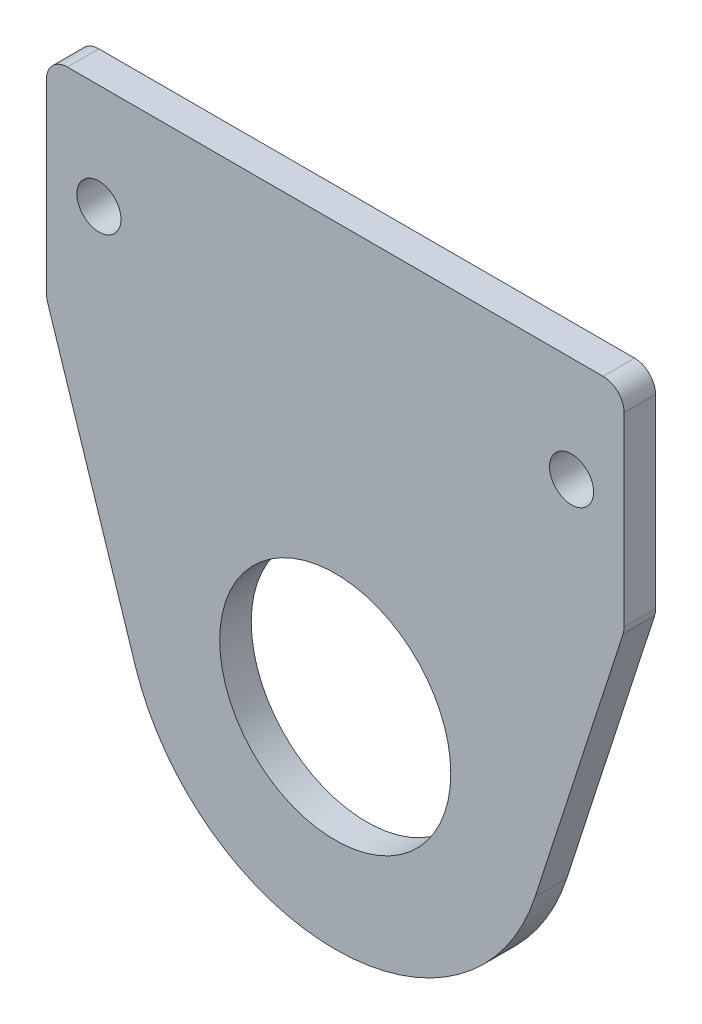
ISO-10303-21;
HEADER;
FILE_DESCRIPTION(('STEP AP214'),'2;1');
FILE_NAME('part.step','',(''),(''),'','','');
FILE_SCHEMA(('AUTOMOTIVE_DESIGN { 1 0 10303 214 1 1 1 1 }'));
ENDSEC;
DATA;
#1=APPLICATION_CONTEXT('core data for automotive mechanical design processes');
#2=APPLICATION_PROTOCOL_DEFINITION('international standard','automotive_design',2000,#1);
#3=PRODUCT_CONTEXT('',#1,'mechanical');
#4=PRODUCT('Part','Part','',(#3));
#5=PRODUCT_RELATED_PRODUCT_CATEGORY('part','',(#4));
#6=PRODUCT_DEFINITION_FORMATION('','',#4);
#7=PRODUCT_DEFINITION_CONTEXT('part definition',#1,'design');
#8=PRODUCT_DEFINITION('design','',#6,#7);
#9=PRODUCT_DEFINITION_SHAPE('','',#8);
#10=(LENGTH_UNIT() NAMED_UNIT(*) SI_UNIT(.MILLI.,.METRE.));
#11=(NAMED_UNIT(*) PLANE_ANGLE_UNIT() SI_UNIT($,.RADIAN.));
#12=(NAMED_UNIT(*) SI_UNIT($,.STERADIAN.) SOLID_ANGLE_UNIT());
#13=UNCERTAINTY_MEASURE_WITH_UNIT(LENGTH_MEASURE(1.E-05),#10,'distance_accuracy_value','');
#14=(GEOMETRIC_REPRESENTATION_CONTEXT(3) GLOBAL_UNCERTAINTY_ASSIGNED_CONTEXT((#13)) GLOBAL_UNIT_ASSIGNED_CONTEXT((#10,
#11,#12)) REPRESENTATION_CONTEXT('',''));
#15=CARTESIAN_POINT('',(0.,0.,0.));
#16=DIRECTION('',(0.,0.,1.));
#17=DIRECTION('',(1.,0.,0.));
#18=AXIS2_PLACEMENT_3D('',#15,#16,#17);
#19=CARTESIAN_POINT('',(27.5,0.,3.));
#20=DIRECTION('',(1.,0.,0.));
#21=DIRECTION('',(0.,0.,-1.));
#22=AXIS2_PLACEMENT_3D('',#19,#20,#21);
#23=PLANE('',#22);
#24=DIRECTION('',(0.,-1.,0.));
#25=VECTOR('',#24,1.);
#26=CARTESIAN_POINT('',(27.5,0.,3.));
#27=LINE('',#26,#25);
#28=CARTESIAN_POINT('',(27.5,8.,3.));
#29=VERTEX_POINT('',#28);
#30=CARTESIAN_POINT('',(27.5,-9.68421052631579,3.));
#31=VERTEX_POINT('',#30);
#32=EDGE_CURVE('E181',#29,#31,#27,.T.);
#33=ORIENTED_EDGE('',*,*,#32,.T.);
#34=DIRECTION('',(0.,0.,-1.));
#35=VECTOR('',#34,1.);
#36=CARTESIAN_POINT('',(27.5,-9.68421052631579,3.));
#37=LINE('',#36,#35);
#38=CARTESIAN_POINT('',(27.5,-9.68421052631579,0.));
#39=VERTEX_POINT('',#38);
#40=EDGE_CURVE('E205',#31,#39,#37,.T.);
#41=ORIENTED_EDGE('',*,*,#40,.T.);
#42=DIRECTION('',(0.,-1.,0.));
#43=VECTOR('',#42,1.);
#44=CARTESIAN_POINT('',(27.5,0.,0.));
#45=LINE('',#44,#43);
#46=CARTESIAN_POINT('',(27.5,8.,0.));
#47=VERTEX_POINT('',#46);
#48=EDGE_CURVE('E158',#47,#39,#45,.T.);
#49=ORIENTED_EDGE('',*,*,#48,.F.);
#50=DIRECTION('',(0.,0.,-1.));
#51=VECTOR('',#50,1.);
#52=CARTESIAN_POINT('',(27.5,8.,3.));
#53=LINE('',#52,#51);
#54=EDGE_CURVE('E203',#47,#29,#53,.F.);
#55=ORIENTED_EDGE('',*,*,#54,.T.);
#56=EDGE_LOOP('',(#33,#41,#49,#55));
#57=FACE_BOUND('',#56,.T.);
#58=ADVANCED_FACE('F37',(#57),#23,.T.);
#59=CARTESIAN_POINT('',(0.,10.,3.));
#60=DIRECTION('',(0.,1.,0.));
#61=DIRECTION('',(0.,0.,1.));
#62=AXIS2_PLACEMENT_3D('',#59,#60,#61);
#63=PLANE('',#62);
#64=DIRECTION('',(1.,0.,0.));
#65=VECTOR('',#64,1.);
#66=CARTESIAN_POINT('',(0.,10.,3.));
#67=LINE('',#66,#65);
#68=CARTESIAN_POINT('',(-25.5,10.,3.));
#69=VERTEX_POINT('',#68);
#70=CARTESIAN_POINT('',(25.5,10.,3.));
#71=VERTEX_POINT('',#70);
#72=EDGE_CURVE('E212',#69,#71,#67,.T.);
#73=ORIENTED_EDGE('',*,*,#72,.T.);
#74=DIRECTION('',(0.,0.,-1.));
#75=VECTOR('',#74,1.);
#76=CARTESIAN_POINT('',(25.5,10.,3.));
#77=LINE('',#76,#75);
#78=CARTESIAN_POINT('',(25.5,10.,0.));
#79=VERTEX_POINT('',#78);
#80=EDGE_CURVE('E11',#71,#79,#77,.T.);
#81=ORIENTED_EDGE('',*,*,#80,.T.);
#82=DIRECTION('',(1.,0.,0.));
#83=VECTOR('',#82,1.);
#84=CARTESIAN_POINT('',(0.,10.,0.));
#85=LINE('',#84,#83);
#86=CARTESIAN_POINT('',(-25.5,10.,0.));
#87=VERTEX_POINT('',#86);
#88=EDGE_CURVE('E161',#87,#79,#85,.T.);
#89=ORIENTED_EDGE('',*,*,#88,.F.);
#90=DIRECTION('',(0.,0.,-1.));
#91=VECTOR('',#90,1.);
#92=CARTESIAN_POINT('',(-25.5,10.,3.));
#93=LINE('',#92,#91);
#94=EDGE_CURVE('E45',#87,#69,#93,.F.);
#95=ORIENTED_EDGE('',*,*,#94,.T.);
#96=EDGE_LOOP('',(#73,#81,#89,#95));
#97=FACE_BOUND('',#96,.T.);
#98=ADVANCED_FACE('F211',(#97),#63,.T.);
#99=CARTESIAN_POINT('',(-27.5,0.,3.));
#100=DIRECTION('',(1.,0.,0.));
#101=DIRECTION('',(0.,0.,-1.));
#102=AXIS2_PLACEMENT_3D('',#99,#100,#101);
#103=PLANE('',#102);
#104=DIRECTION('',(0.,-1.,0.));
#105=VECTOR('',#104,1.);
#106=CARTESIAN_POINT('',(-27.5,0.,0.));
#107=LINE('',#106,#105);
#108=CARTESIAN_POINT('',(-27.5,8.,0.));
#109=VERTEX_POINT('',#108);
#110=CARTESIAN_POINT('',(-27.5,-9.68421052631581,0.));
#111=VERTEX_POINT('',#110);
#112=EDGE_CURVE('E164',#109,#111,#107,.T.);
#113=ORIENTED_EDGE('',*,*,#112,.T.);
#114=DIRECTION('',(0.,0.,-1.));
#115=VECTOR('',#114,1.);
#116=CARTESIAN_POINT('',(-27.5,-9.68421052631581,3.));
#117=LINE('',#116,#115);
#118=CARTESIAN_POINT('',(-27.5,-9.68421052631581,3.));
#119=VERTEX_POINT('',#118);
#120=EDGE_CURVE('E195',#111,#119,#117,.F.);
#121=ORIENTED_EDGE('',*,*,#120,.T.);
#122=DIRECTION('',(0.,-1.,0.));
#123=VECTOR('',#122,1.);
#124=CARTESIAN_POINT('',(-27.5,0.,3.));
#125=LINE('',#124,#123);
#126=CARTESIAN_POINT('',(-27.5,8.,3.));
#127=VERTEX_POINT('',#126);
#128=EDGE_CURVE('E129',#127,#119,#125,.T.);
#129=ORIENTED_EDGE('',*,*,#128,.F.);
#130=DIRECTION('',(0.,0.,-1.));
#131=VECTOR('',#130,1.);
#132=CARTESIAN_POINT('',(-27.5,8.,0.));
#133=LINE('',#132,#131);
#134=EDGE_CURVE('E192',#127,#109,#133,.T.);
#135=ORIENTED_EDGE('',*,*,#134,.T.);
#136=EDGE_LOOP('',(#113,#121,#129,#135));
#137=FACE_BOUND('',#136,.T.);
#138=ADVANCED_FACE('F221',(#137),#103,.F.);
#139=CARTESIAN_POINT('',(-27.8205989773557,-9.01008035062088,3.));
#140=DIRECTION('',(0.951351351351351,0.308108108108108,0.));
#141=DIRECTION('',(-0.308108108108108,0.951351351351352,0.));
#142=AXIS2_PLACEMENT_3D('',#139,#140,#141);
#143=PLANE('',#142);
#144=DIRECTION('',(0.308108108108108,-0.951351351351352,0.));
#145=VECTOR('',#144,1.);
#146=CARTESIAN_POINT('',(-27.8205989773557,-9.01008035062088,3.));
#147=LINE('',#146,#145);
#148=CARTESIAN_POINT('',(-27.4027027027027,-10.300426742532,3.));
#149=VERTEX_POINT('',#148);
#150=CARTESIAN_POINT('',(-19.027027027027,-36.1621621621621,3.));
#151=VERTEX_POINT('',#150);
#152=EDGE_CURVE('E116',#149,#151,#147,.T.);
#153=ORIENTED_EDGE('',*,*,#152,.F.);
#154=DIRECTION('',(0.,0.,-1.));
#155=VECTOR('',#154,1.);
#156=CARTESIAN_POINT('',(-27.4027027027027,-10.300426742532,3.));
#157=LINE('',#156,#155);
#158=CARTESIAN_POINT('',(-27.4027027027027,-10.300426742532,0.));
#159=VERTEX_POINT('',#158);
#160=EDGE_CURVE('E139',#149,#159,#157,.T.);
#161=ORIENTED_EDGE('',*,*,#160,.T.);
#162=DIRECTION('',(0.308108108108108,-0.951351351351352,0.));
#163=VECTOR('',#162,1.);
#164=CARTESIAN_POINT('',(-27.8205989773557,-9.01008035062088,0.));
#165=LINE('',#164,#163);
#166=CARTESIAN_POINT('',(-19.027027027027,-36.1621621621621,0.));
#167=VERTEX_POINT('',#166);
#168=EDGE_CURVE('E135',#159,#167,#165,.T.);
#169=ORIENTED_EDGE('',*,*,#168,.T.);
#170=DIRECTION('',(0.,0.,-1.));
#171=VECTOR('',#170,1.);
#172=CARTESIAN_POINT('',(-19.027027027027,-36.1621621621621,3.));
#173=LINE('',#172,#171);
#174=EDGE_CURVE('E132',#151,#167,#173,.T.);
#175=ORIENTED_EDGE('',*,*,#174,.F.);
#176=EDGE_LOOP('',(#153,#161,#169,#175));
#177=FACE_BOUND('',#176,.T.);
#178=ADVANCED_FACE('F133',(#177),#143,.F.);
#179=CARTESIAN_POINT('',(0.,-30.,3.));
#180=DIRECTION('',(0.,0.,-1.));
#181=DIRECTION('',(-1.,0.,0.));
#182=AXIS2_PLACEMENT_3D('',#179,#180,#181);
#183=CYLINDRICAL_SURFACE('',#182,20.);
#184=CARTESIAN_POINT('',(0.,-30.,0.));
#185=DIRECTION('',(0.,0.,1.));
#186=DIRECTION('',(1.,0.,0.));
#187=AXIS2_PLACEMENT_3D('',#184,#185,#186);
#188=CIRCLE('',#187,20.);
#189=CARTESIAN_POINT('',(19.027027027027,-36.1621621621621,0.));
#190=VERTEX_POINT('',#189);
#191=EDGE_CURVE('E168',#167,#190,#188,.T.);
#192=ORIENTED_EDGE('',*,*,#191,.T.);
#193=DIRECTION('',(0.,0.,-1.));
#194=VECTOR('',#193,1.);
#195=CARTESIAN_POINT('',(19.027027027027,-36.1621621621621,3.));
#196=LINE('',#195,#194);
#197=CARTESIAN_POINT('',(19.027027027027,-36.1621621621621,3.));
#198=VERTEX_POINT('',#197);
#199=EDGE_CURVE('E140',#198,#190,#196,.T.);
#200=ORIENTED_EDGE('',*,*,#199,.F.);
#201=CARTESIAN_POINT('',(0.,-30.,3.));
#202=DIRECTION('',(0.,0.,1.));
#203=DIRECTION('',(1.,0.,0.));
#204=AXIS2_PLACEMENT_3D('',#201,#202,#203);
#205=CIRCLE('',#204,20.);
#206=EDGE_CURVE('E122',#151,#198,#205,.T.);
#207=ORIENTED_EDGE('',*,*,#206,.F.);
#208=ORIENTED_EDGE('',*,*,#174,.T.);
#209=EDGE_LOOP('',(#192,#200,#207,#208));
#210=FACE_BOUND('',#209,.T.);
#211=ADVANCED_FACE('F142',(#210),#183,.T.);
#212=CARTESIAN_POINT('',(-22.5,0.,3.));
#213=DIRECTION('',(0.,0.,-1.));
#214=DIRECTION('',(-1.,0.,0.));
#215=AXIS2_PLACEMENT_3D('',#212,#213,#214);
#216=CYLINDRICAL_SURFACE('',#215,2.1);
#217=CARTESIAN_POINT('',(-22.5,0.,3.));
#218=DIRECTION('',(0.,0.,1.));
#219=DIRECTION('',(1.,0.,0.));
#220=AXIS2_PLACEMENT_3D('',#217,#218,#219);
#221=CIRCLE('',#220,2.1);
#222=CARTESIAN_POINT('',(-20.4,0.,3.));
#223=VERTEX_POINT('',#222);
#224=EDGE_CURVE('E152',#223,#223,#221,.F.);
#225=ORIENTED_EDGE('',*,*,#224,.F.);
#226=EDGE_LOOP('',(#225));
#227=FACE_BOUND('',#226,.T.);
#228=CARTESIAN_POINT('',(-22.5,0.,0.));
#229=DIRECTION('',(0.,0.,1.));
#230=DIRECTION('',(1.,0.,0.));
#231=AXIS2_PLACEMENT_3D('',#228,#229,#230);
#232=CIRCLE('',#231,2.1);
#233=CARTESIAN_POINT('',(-20.4,0.,0.));
#234=VERTEX_POINT('',#233);
#235=EDGE_CURVE('E175',#234,#234,#232,.F.);
#236=ORIENTED_EDGE('',*,*,#235,.T.);
#237=EDGE_LOOP('',(#236));
#238=FACE_BOUND('',#237,.T.);
#239=ADVANCED_FACE('F248',(#227,#238),#216,.F.);
#240=CARTESIAN_POINT('',(22.5,0.,3.));
#241=DIRECTION('',(0.,0.,-1.));
#242=DIRECTION('',(-1.,0.,0.));
#243=AXIS2_PLACEMENT_3D('',#240,#241,#242);
#244=CYLINDRICAL_SURFACE('',#243,2.1);
#245=CARTESIAN_POINT('',(22.5,0.,3.));
#246=DIRECTION('',(0.,0.,1.));
#247=DIRECTION('',(1.,0.,0.));
#248=AXIS2_PLACEMENT_3D('',#245,#246,#247);
#249=CIRCLE('',#248,2.1);
#250=CARTESIAN_POINT('',(24.6,0.,3.));
#251=VERTEX_POINT('',#250);
#252=EDGE_CURVE('E146',#251,#251,#249,.T.);
#253=ORIENTED_EDGE('',*,*,#252,.T.);
#254=EDGE_LOOP('',(#253));
#255=FACE_BOUND('',#254,.T.);
#256=CARTESIAN_POINT('',(22.5,0.,0.));
#257=DIRECTION('',(0.,0.,1.));
#258=DIRECTION('',(1.,0.,0.));
#259=AXIS2_PLACEMENT_3D('',#256,#257,#258);
#260=CIRCLE('',#259,2.1);
#261=CARTESIAN_POINT('',(24.6,0.,0.));
#262=VERTEX_POINT('',#261);
#263=EDGE_CURVE('E172',#262,#262,#260,.T.);
#264=ORIENTED_EDGE('',*,*,#263,.F.);
#265=EDGE_LOOP('',(#264));
#266=FACE_BOUND('',#265,.T.);
#267=ADVANCED_FACE('F240',(#255,#266),#244,.F.);
#268=CARTESIAN_POINT('',(27.8205989773557,-9.01008035062089,3.));
#269=DIRECTION('',(0.951351351351351,-0.308108108108108,0.));
#270=DIRECTION('',(0.308108108108108,0.951351351351352,0.));
#271=AXIS2_PLACEMENT_3D('',#268,#269,#270);
#272=PLANE('',#271);
#273=DIRECTION('',(-0.308108108108108,-0.951351351351351,0.));
#274=VECTOR('',#273,1.);
#275=CARTESIAN_POINT('',(27.8205989773557,-9.01008035062089,0.));
#276=LINE('',#275,#274);
#277=CARTESIAN_POINT('',(27.4027027027027,-10.300426742532,0.));
#278=VERTEX_POINT('',#277);
#279=EDGE_CURVE('E170',#278,#190,#276,.T.);
#280=ORIENTED_EDGE('',*,*,#279,.F.);
#281=DIRECTION('',(0.,0.,-1.));
#282=VECTOR('',#281,1.);
#283=CARTESIAN_POINT('',(27.4027027027027,-10.300426742532,3.));
#284=LINE('',#283,#282);
#285=CARTESIAN_POINT('',(27.4027027027027,-10.300426742532,3.));
#286=VERTEX_POINT('',#285);
#287=EDGE_CURVE('E52',#278,#286,#284,.F.);
#288=ORIENTED_EDGE('',*,*,#287,.T.);
#289=DIRECTION('',(-0.308108108108108,-0.951351351351351,0.));
#290=VECTOR('',#289,1.);
#291=CARTESIAN_POINT('',(27.8205989773557,-9.01008035062089,3.));
#292=LINE('',#291,#290);
#293=EDGE_CURVE('E144',#286,#198,#292,.T.);
#294=ORIENTED_EDGE('',*,*,#293,.T.);
#295=ORIENTED_EDGE('',*,*,#199,.T.);
#296=EDGE_LOOP('',(#280,#288,#294,#295));
#297=FACE_BOUND('',#296,.T.);
#298=ADVANCED_FACE('F237',(#297),#272,.T.);
#299=CARTESIAN_POINT('',(0.,-30.,3.));
#300=DIRECTION('',(0.,0.,-1.));
#301=DIRECTION('',(-1.,0.,0.));
#302=AXIS2_PLACEMENT_3D('',#299,#300,#301);
#303=CYLINDRICAL_SURFACE('',#302,11.);
#304=CARTESIAN_POINT('',(0.,-30.,3.));
#305=DIRECTION('',(0.,0.,1.));
#306=DIRECTION('',(1.,0.,0.));
#307=AXIS2_PLACEMENT_3D('',#304,#305,#306);
#308=CIRCLE('',#307,11.);
#309=CARTESIAN_POINT('',(11.,-30.,3.));
#310=VERTEX_POINT('',#309);
#311=EDGE_CURVE('E155',#310,#310,#308,.T.);
#312=ORIENTED_EDGE('',*,*,#311,.T.);
#313=EDGE_LOOP('',(#312));
#314=FACE_BOUND('',#313,.T.);
#315=CARTESIAN_POINT('',(0.,-30.,0.));
#316=DIRECTION('',(0.,0.,1.));
#317=DIRECTION('',(1.,0.,0.));
#318=AXIS2_PLACEMENT_3D('',#315,#316,#317);
#319=CIRCLE('',#318,11.);
#320=CARTESIAN_POINT('',(11.,-30.,0.));
#321=VERTEX_POINT('',#320);
#322=EDGE_CURVE('E178',#321,#321,#319,.T.);
#323=ORIENTED_EDGE('',*,*,#322,.F.);
#324=EDGE_LOOP('',(#323));
#325=FACE_BOUND('',#324,.T.);
#326=ADVANCED_FACE('F239',(#314,#325),#303,.F.);
#327=CARTESIAN_POINT('',(0.,0.,3.));
#328=DIRECTION('',(0.,0.,1.));
#329=DIRECTION('',(1.,0.,0.));
#330=AXIS2_PLACEMENT_3D('',#327,#328,#329);
#331=PLANE('',#330);
#332=ORIENTED_EDGE('',*,*,#128,.T.);
#333=CARTESIAN_POINT('',(-25.5,-9.68421052631581,3.));
#334=DIRECTION('',(0.,0.,1.));
#335=DIRECTION('',(1.,0.,0.));
#336=AXIS2_PLACEMENT_3D('',#333,#334,#335);
#337=CIRCLE('',#336,2.);
#338=EDGE_CURVE('E125',#119,#149,#337,.T.);
#339=ORIENTED_EDGE('',*,*,#338,.T.);
#340=ORIENTED_EDGE('',*,*,#152,.T.);
#341=ORIENTED_EDGE('',*,*,#206,.T.);
#342=ORIENTED_EDGE('',*,*,#293,.F.);
#343=CARTESIAN_POINT('',(25.5,-9.68421052631579,3.));
#344=DIRECTION('',(0.,0.,1.));
#345=DIRECTION('',(1.,0.,0.));
#346=AXIS2_PLACEMENT_3D('',#343,#344,#345);
#347=CIRCLE('',#346,2.);
#348=EDGE_CURVE('E200',#286,#31,#347,.T.);
#349=ORIENTED_EDGE('',*,*,#348,.T.);
#350=ORIENTED_EDGE('',*,*,#32,.F.);
#351=CARTESIAN_POINT('',(25.5,8.,3.));
#352=DIRECTION('',(0.,0.,1.));
#353=DIRECTION('',(1.,0.,0.));
#354=AXIS2_PLACEMENT_3D('',#351,#352,#353);
#355=CIRCLE('',#354,2.);
#356=EDGE_CURVE('E60',#29,#71,#355,.T.);
#357=ORIENTED_EDGE('',*,*,#356,.T.);
#358=ORIENTED_EDGE('',*,*,#72,.F.);
#359=CARTESIAN_POINT('',(-25.5,8.,3.));
#360=DIRECTION('',(0.,0.,1.));
#361=DIRECTION('',(1.,0.,0.));
#362=AXIS2_PLACEMENT_3D('',#359,#360,#361);
#363=CIRCLE('',#362,2.);
#364=EDGE_CURVE('E197',#69,#127,#363,.T.);
#365=ORIENTED_EDGE('',*,*,#364,.T.);
#366=EDGE_LOOP('',(#332,#339,#340,#341,#342,#349,#350,#357,#358,#365));
#367=FACE_BOUND('',#366,.T.);
#368=ORIENTED_EDGE('',*,*,#252,.F.);
#369=EDGE_LOOP('',(#368));
#370=FACE_BOUND('',#369,.T.);
#371=ORIENTED_EDGE('',*,*,#224,.T.);
#372=EDGE_LOOP('',(#371));
#373=FACE_BOUND('',#372,.T.);
#374=ORIENTED_EDGE('',*,*,#311,.F.);
#375=EDGE_LOOP('',(#374));
#376=FACE_BOUND('',#375,.T.);
#377=ADVANCED_FACE('F119',(#367,#370,#373,#376),#331,.T.);
#378=CARTESIAN_POINT('',(0.,0.,0.));
#379=DIRECTION('',(0.,0.,1.));
#380=DIRECTION('',(1.,0.,0.));
#381=AXIS2_PLACEMENT_3D('',#378,#379,#380);
#382=PLANE('',#381);
#383=ORIENTED_EDGE('',*,*,#168,.F.);
#384=CARTESIAN_POINT('',(-25.5,-9.68421052631581,0.));
#385=DIRECTION('',(0.,0.,1.));
#386=DIRECTION('',(1.,0.,0.));
#387=AXIS2_PLACEMENT_3D('',#384,#385,#386);
#388=CIRCLE('',#387,2.);
#389=EDGE_CURVE('E190',#159,#111,#388,.F.);
#390=ORIENTED_EDGE('',*,*,#389,.T.);
#391=ORIENTED_EDGE('',*,*,#112,.F.);
#392=CARTESIAN_POINT('',(-25.5,8.,0.));
#393=DIRECTION('',(0.,0.,1.));
#394=DIRECTION('',(1.,0.,0.));
#395=AXIS2_PLACEMENT_3D('',#392,#393,#394);
#396=CIRCLE('',#395,2.);
#397=EDGE_CURVE('E184',#109,#87,#396,.F.);
#398=ORIENTED_EDGE('',*,*,#397,.T.);
#399=ORIENTED_EDGE('',*,*,#88,.T.);
#400=CARTESIAN_POINT('',(25.5,8.,0.));
#401=DIRECTION('',(0.,0.,1.));
#402=DIRECTION('',(1.,0.,0.));
#403=AXIS2_PLACEMENT_3D('',#400,#401,#402);
#404=CIRCLE('',#403,2.);
#405=EDGE_CURVE('E186',#79,#47,#404,.F.);
#406=ORIENTED_EDGE('',*,*,#405,.T.);
#407=ORIENTED_EDGE('',*,*,#48,.T.);
#408=CARTESIAN_POINT('',(25.5,-9.68421052631579,0.));
#409=DIRECTION('',(0.,0.,1.));
#410=DIRECTION('',(1.,0.,0.));
#411=AXIS2_PLACEMENT_3D('',#408,#409,#410);
#412=CIRCLE('',#411,2.);
#413=EDGE_CURVE('E188',#39,#278,#412,.F.);
#414=ORIENTED_EDGE('',*,*,#413,.T.);
#415=ORIENTED_EDGE('',*,*,#279,.T.);
#416=ORIENTED_EDGE('',*,*,#191,.F.);
#417=EDGE_LOOP('',(#383,#390,#391,#398,#399,#406,#407,#414,#415,#416));
#418=FACE_BOUND('',#417,.T.);
#419=ORIENTED_EDGE('',*,*,#263,.T.);
#420=EDGE_LOOP('',(#419));
#421=FACE_BOUND('',#420,.T.);
#422=ORIENTED_EDGE('',*,*,#235,.F.);
#423=EDGE_LOOP('',(#422));
#424=FACE_BOUND('',#423,.T.);
#425=ORIENTED_EDGE('',*,*,#322,.T.);
#426=EDGE_LOOP('',(#425));
#427=FACE_BOUND('',#426,.T.);
#428=ADVANCED_FACE('F224',(#418,#421,#424,#427),#382,.F.);
#429=CARTESIAN_POINT('',(-25.5,-9.68421052631581,3.));
#430=DIRECTION('',(0.,0.,-1.));
#431=DIRECTION('',(-1.,0.,0.));
#432=AXIS2_PLACEMENT_3D('',#429,#430,#431);
#433=CYLINDRICAL_SURFACE('',#432,2.);
#434=ORIENTED_EDGE('',*,*,#338,.F.);
#435=ORIENTED_EDGE('',*,*,#120,.F.);
#436=ORIENTED_EDGE('',*,*,#389,.F.);
#437=ORIENTED_EDGE('',*,*,#160,.F.);
#438=EDGE_LOOP('',(#434,#435,#436,#437));
#439=FACE_BOUND('',#438,.T.);
#440=ADVANCED_FACE('F227',(#439),#433,.T.);
#441=CARTESIAN_POINT('',(25.5,-9.68421052631579,3.));
#442=DIRECTION('',(0.,0.,-1.));
#443=DIRECTION('',(-1.,0.,0.));
#444=AXIS2_PLACEMENT_3D('',#441,#442,#443);
#445=CYLINDRICAL_SURFACE('',#444,2.);
#446=ORIENTED_EDGE('',*,*,#348,.F.);
#447=ORIENTED_EDGE('',*,*,#287,.F.);
#448=ORIENTED_EDGE('',*,*,#413,.F.);
#449=ORIENTED_EDGE('',*,*,#40,.F.);
#450=EDGE_LOOP('',(#446,#447,#448,#449));
#451=FACE_BOUND('',#450,.T.);
#452=ADVANCED_FACE('F236',(#451),#445,.T.);
#453=CARTESIAN_POINT('',(25.5,8.,3.));
#454=DIRECTION('',(0.,0.,-1.));
#455=DIRECTION('',(-1.,0.,0.));
#456=AXIS2_PLACEMENT_3D('',#453,#454,#455);
#457=CYLINDRICAL_SURFACE('',#456,2.);
#458=ORIENTED_EDGE('',*,*,#356,.F.);
#459=ORIENTED_EDGE('',*,*,#54,.F.);
#460=ORIENTED_EDGE('',*,*,#405,.F.);
#461=ORIENTED_EDGE('',*,*,#80,.F.);
#462=EDGE_LOOP('',(#458,#459,#460,#461));
#463=FACE_BOUND('',#462,.T.);
#464=ADVANCED_FACE('F263',(#463),#457,.T.);
#465=CARTESIAN_POINT('',(-25.5,8.,3.));
#466=DIRECTION('',(0.,0.,1.));
#467=DIRECTION('',(1.,0.,0.));
#468=AXIS2_PLACEMENT_3D('',#465,#466,#467);
#469=CYLINDRICAL_SURFACE('',#468,2.);
#470=ORIENTED_EDGE('',*,*,#364,.F.);
#471=ORIENTED_EDGE('',*,*,#94,.F.);
#472=ORIENTED_EDGE('',*,*,#397,.F.);
#473=ORIENTED_EDGE('',*,*,#134,.F.);
#474=EDGE_LOOP('',(#470,#471,#472,#473));
#475=FACE_BOUND('',#474,.T.);
#476=ADVANCED_FACE('F39',(#475),#469,.T.);
#477=CLOSED_SHELL('',(#58,#98,#138,#178,#211,#239,#267,#298,#326,#377,#428,#440,#452,#464,#476));
#478=MANIFOLD_SOLID_BREP('B2',#477);
#479=ADVANCED_BREP_SHAPE_REPRESENTATION('',(#18,#478),#14);
#480=SHAPE_DEFINITION_REPRESENTATION(#9,#479);
ENDSEC;
END-ISO-10303-21;
